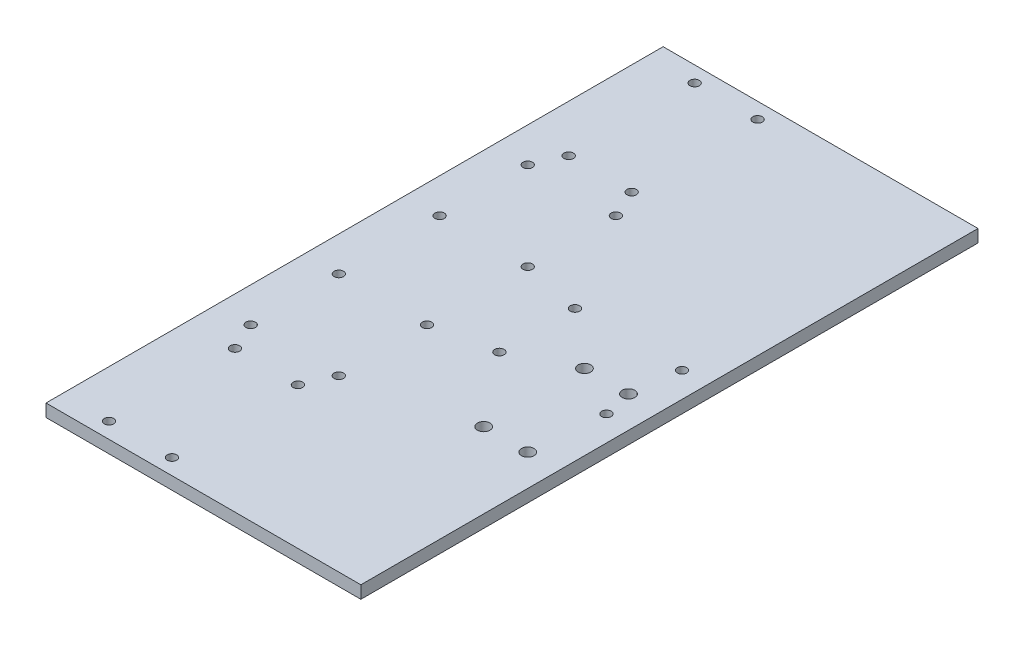
ISO-10303-21;
HEADER;
FILE_DESCRIPTION(('STEP AP214'),'2;1');
FILE_NAME('part.step','',(''),(''),'','','');
FILE_SCHEMA(('AUTOMOTIVE_DESIGN { 1 0 10303 214 1 1 1 1 }'));
ENDSEC;
DATA;
#1=APPLICATION_CONTEXT('core data for automotive mechanical design processes');
#2=APPLICATION_PROTOCOL_DEFINITION('international standard','automotive_design',2000,#1);
#3=PRODUCT_CONTEXT('',#1,'mechanical');
#4=PRODUCT('Part','Part','',(#3));
#5=PRODUCT_RELATED_PRODUCT_CATEGORY('part','',(#4));
#6=PRODUCT_DEFINITION_FORMATION('','',#4);
#7=PRODUCT_DEFINITION_CONTEXT('part definition',#1,'design');
#8=PRODUCT_DEFINITION('design','',#6,#7);
#9=PRODUCT_DEFINITION_SHAPE('','',#8);
#10=(LENGTH_UNIT() NAMED_UNIT(*) SI_UNIT(.MILLI.,.METRE.));
#11=(NAMED_UNIT(*) PLANE_ANGLE_UNIT() SI_UNIT($,.RADIAN.));
#12=(NAMED_UNIT(*) SI_UNIT($,.STERADIAN.) SOLID_ANGLE_UNIT());
#13=UNCERTAINTY_MEASURE_WITH_UNIT(LENGTH_MEASURE(1.E-05),#10,'distance_accuracy_value','');
#14=(GEOMETRIC_REPRESENTATION_CONTEXT(3) GLOBAL_UNCERTAINTY_ASSIGNED_CONTEXT((#13)) GLOBAL_UNIT_ASSIGNED_CONTEXT((#10,
#11,#12)) REPRESENTATION_CONTEXT('',''));
#15=CARTESIAN_POINT('',(0.,0.,0.));
#16=DIRECTION('',(0.,0.,1.));
#17=DIRECTION('',(1.,0.,0.));
#18=AXIS2_PLACEMENT_3D('',#15,#16,#17);
#19=CARTESIAN_POINT('',(-15.,-6.,-53.));
#20=DIRECTION('',(0.,1.,0.));
#21=DIRECTION('',(0.,0.,1.));
#22=AXIS2_PLACEMENT_3D('',#19,#20,#21);
#23=CYLINDRICAL_SURFACE('',#22,1.5);
#24=CARTESIAN_POINT('',(-15.,0.,-53.));
#25=DIRECTION('',(0.,-1.,0.));
#26=DIRECTION('',(0.,0.,-1.));
#27=AXIS2_PLACEMENT_3D('',#24,#25,#26);
#28=CIRCLE('',#27,1.5);
#29=CARTESIAN_POINT('',(-15.,0.,-54.5));
#30=VERTEX_POINT('',#29);
#31=EDGE_CURVE('E51',#30,#30,#28,.T.);
#32=ORIENTED_EDGE('',*,*,#31,.T.);
#33=EDGE_LOOP('',(#32));
#34=FACE_BOUND('',#33,.T.);
#35=CARTESIAN_POINT('',(-15.,4.,-53.));
#36=DIRECTION('',(0.,1.,0.));
#37=DIRECTION('',(0.,0.,1.));
#38=AXIS2_PLACEMENT_3D('',#35,#36,#37);
#39=CIRCLE('',#38,1.5);
#40=CARTESIAN_POINT('',(-15.,4.,-51.5));
#41=VERTEX_POINT('',#40);
#42=EDGE_CURVE('E11',#41,#41,#39,.T.);
#43=ORIENTED_EDGE('',*,*,#42,.T.);
#44=EDGE_LOOP('',(#43));
#45=FACE_BOUND('',#44,.T.);
#46=ADVANCED_FACE('F43',(#34,#45),#23,.F.);
#47=CARTESIAN_POINT('',(-15.,-6.,-93.));
#48=DIRECTION('',(0.,1.,0.));
#49=DIRECTION('',(0.,0.,1.));
#50=AXIS2_PLACEMENT_3D('',#47,#48,#49);
#51=CYLINDRICAL_SURFACE('',#50,1.5);
#52=CARTESIAN_POINT('',(-15.,0.,-93.));
#53=DIRECTION('',(0.,-1.,0.));
#54=DIRECTION('',(0.,0.,-1.));
#55=AXIS2_PLACEMENT_3D('',#52,#53,#54);
#56=CIRCLE('',#55,1.5);
#57=CARTESIAN_POINT('',(-15.,0.,-94.5));
#58=VERTEX_POINT('',#57);
#59=EDGE_CURVE('E222',#58,#58,#56,.T.);
#60=ORIENTED_EDGE('',*,*,#59,.T.);
#61=EDGE_LOOP('',(#60));
#62=FACE_BOUND('',#61,.T.);
#63=CARTESIAN_POINT('',(-15.,4.,-93.));
#64=DIRECTION('',(0.,1.,0.));
#65=DIRECTION('',(0.,0.,1.));
#66=AXIS2_PLACEMENT_3D('',#63,#64,#65);
#67=CIRCLE('',#66,1.5);
#68=CARTESIAN_POINT('',(-15.,4.,-91.5));
#69=VERTEX_POINT('',#68);
#70=EDGE_CURVE('E229',#69,#69,#67,.T.);
#71=ORIENTED_EDGE('',*,*,#70,.T.);
#72=EDGE_LOOP('',(#71));
#73=FACE_BOUND('',#72,.T.);
#74=ADVANCED_FACE('F287',(#62,#73),#51,.F.);
#75=CARTESIAN_POINT('',(50.,4.,80.));
#76=DIRECTION('',(-1.,0.,0.));
#77=DIRECTION('',(0.,0.,1.));
#78=AXIS2_PLACEMENT_3D('',#75,#76,#77);
#79=PLANE('',#78);
#80=DIRECTION('',(0.,0.,-1.));
#81=VECTOR('',#80,1.);
#82=CARTESIAN_POINT('',(50.,0.,80.));
#83=LINE('',#82,#81);
#84=CARTESIAN_POINT('',(50.,0.,98.));
#85=VERTEX_POINT('',#84);
#86=CARTESIAN_POINT('',(50.,0.,-98.));
#87=VERTEX_POINT('',#86);
#88=EDGE_CURVE('E218',#85,#87,#83,.T.);
#89=ORIENTED_EDGE('',*,*,#88,.T.);
#90=DIRECTION('',(0.,-1.,0.));
#91=VECTOR('',#90,1.);
#92=CARTESIAN_POINT('',(50.,4.,-98.));
#93=LINE('',#92,#91);
#94=CARTESIAN_POINT('',(50.,4.,-98.));
#95=VERTEX_POINT('',#94);
#96=EDGE_CURVE('E92',#95,#87,#93,.T.);
#97=ORIENTED_EDGE('',*,*,#96,.F.);
#98=DIRECTION('',(0.,0.,-1.));
#99=VECTOR('',#98,1.);
#100=CARTESIAN_POINT('',(50.,4.,80.));
#101=LINE('',#100,#99);
#102=CARTESIAN_POINT('',(50.,4.,98.));
#103=VERTEX_POINT('',#102);
#104=EDGE_CURVE('E59',#103,#95,#101,.T.);
#105=ORIENTED_EDGE('',*,*,#104,.F.);
#106=DIRECTION('',(0.,-1.,0.));
#107=VECTOR('',#106,1.);
#108=CARTESIAN_POINT('',(50.,4.,98.));
#109=LINE('',#108,#107);
#110=EDGE_CURVE('E89',#103,#85,#109,.T.);
#111=ORIENTED_EDGE('',*,*,#110,.T.);
#112=EDGE_LOOP('',(#89,#97,#105,#111));
#113=FACE_BOUND('',#112,.T.);
#114=ADVANCED_FACE('F88',(#113),#79,.F.);
#115=CARTESIAN_POINT('',(-50.,4.,80.));
#116=DIRECTION('',(1.,0.,0.));
#117=DIRECTION('',(0.,0.,-1.));
#118=AXIS2_PLACEMENT_3D('',#115,#116,#117);
#119=PLANE('',#118);
#120=DIRECTION('',(0.,0.,1.));
#121=VECTOR('',#120,1.);
#122=CARTESIAN_POINT('',(-50.,0.,80.));
#123=LINE('',#122,#121);
#124=CARTESIAN_POINT('',(-50.,0.,-98.));
#125=VERTEX_POINT('',#124);
#126=CARTESIAN_POINT('',(-50.,0.,98.));
#127=VERTEX_POINT('',#126);
#128=EDGE_CURVE('E93',#125,#127,#123,.T.);
#129=ORIENTED_EDGE('',*,*,#128,.T.);
#130=DIRECTION('',(0.,1.,0.));
#131=VECTOR('',#130,1.);
#132=CARTESIAN_POINT('',(-50.,0.,98.));
#133=LINE('',#132,#131);
#134=CARTESIAN_POINT('',(-50.,4.,98.));
#135=VERTEX_POINT('',#134);
#136=EDGE_CURVE('E106',#127,#135,#133,.T.);
#137=ORIENTED_EDGE('',*,*,#136,.T.);
#138=DIRECTION('',(0.,0.,1.));
#139=VECTOR('',#138,1.);
#140=CARTESIAN_POINT('',(-50.,4.,80.));
#141=LINE('',#140,#139);
#142=CARTESIAN_POINT('',(-50.,4.,-98.));
#143=VERTEX_POINT('',#142);
#144=EDGE_CURVE('E67',#143,#135,#141,.T.);
#145=ORIENTED_EDGE('',*,*,#144,.F.);
#146=DIRECTION('',(0.,1.,0.));
#147=VECTOR('',#146,1.);
#148=CARTESIAN_POINT('',(-50.,0.,-98.));
#149=LINE('',#148,#147);
#150=EDGE_CURVE('E120',#125,#143,#149,.T.);
#151=ORIENTED_EDGE('',*,*,#150,.F.);
#152=EDGE_LOOP('',(#129,#137,#145,#151));
#153=FACE_BOUND('',#152,.T.);
#154=ADVANCED_FACE('F300',(#153),#119,.F.);
#155=CARTESIAN_POINT('',(0.,4.,0.));
#156=DIRECTION('',(0.,-1.,0.));
#157=DIRECTION('',(0.,0.,-1.));
#158=AXIS2_PLACEMENT_3D('',#155,#156,#157);
#159=PLANE('',#158);
#160=CARTESIAN_POINT('',(-15.,4.,93.));
#161=DIRECTION('',(0.,-1.,0.));
#162=DIRECTION('',(0.,0.,-1.));
#163=AXIS2_PLACEMENT_3D('',#160,#161,#162);
#164=CIRCLE('',#163,1.5);
#165=CARTESIAN_POINT('',(-15.,4.,91.5));
#166=VERTEX_POINT('',#165);
#167=EDGE_CURVE('E256',#166,#166,#164,.T.);
#168=ORIENTED_EDGE('',*,*,#167,.T.);
#169=EDGE_LOOP('',(#168));
#170=FACE_BOUND('',#169,.T.);
#171=CARTESIAN_POINT('',(-35.,4.,53.));
#172=DIRECTION('',(0.,-1.,0.));
#173=DIRECTION('',(0.,0.,-1.));
#174=AXIS2_PLACEMENT_3D('',#171,#172,#173);
#175=CIRCLE('',#174,1.5);
#176=CARTESIAN_POINT('',(-35.,4.,51.5));
#177=VERTEX_POINT('',#176);
#178=EDGE_CURVE('E257',#177,#177,#175,.T.);
#179=ORIENTED_EDGE('',*,*,#178,.T.);
#180=EDGE_LOOP('',(#179));
#181=FACE_BOUND('',#180,.T.);
#182=CARTESIAN_POINT('',(-15.,4.,53.));
#183=DIRECTION('',(0.,-1.,0.));
#184=DIRECTION('',(0.,0.,-1.));
#185=AXIS2_PLACEMENT_3D('',#182,#183,#184);
#186=CIRCLE('',#185,1.5);
#187=CARTESIAN_POINT('',(-15.,4.,51.5));
#188=VERTEX_POINT('',#187);
#189=EDGE_CURVE('E260',#188,#188,#186,.T.);
#190=ORIENTED_EDGE('',*,*,#189,.T.);
#191=EDGE_LOOP('',(#190));
#192=FACE_BOUND('',#191,.T.);
#193=CARTESIAN_POINT('',(-35.,4.,93.));
#194=DIRECTION('',(0.,-1.,0.));
#195=DIRECTION('',(0.,0.,-1.));
#196=AXIS2_PLACEMENT_3D('',#193,#194,#195);
#197=CIRCLE('',#196,1.5);
#198=CARTESIAN_POINT('',(-35.,4.,91.5));
#199=VERTEX_POINT('',#198);
#200=EDGE_CURVE('E238',#199,#199,#197,.T.);
#201=ORIENTED_EDGE('',*,*,#200,.T.);
#202=EDGE_LOOP('',(#201));
#203=FACE_BOUND('',#202,.T.);
#204=CARTESIAN_POINT('',(-35.,4.,-53.));
#205=DIRECTION('',(0.,1.,0.));
#206=DIRECTION('',(0.,0.,1.));
#207=AXIS2_PLACEMENT_3D('',#204,#205,#206);
#208=CIRCLE('',#207,1.5);
#209=CARTESIAN_POINT('',(-35.,4.,-51.5));
#210=VERTEX_POINT('',#209);
#211=EDGE_CURVE('E102',#210,#210,#208,.T.);
#212=ORIENTED_EDGE('',*,*,#211,.F.);
#213=EDGE_LOOP('',(#212));
#214=FACE_BOUND('',#213,.T.);
#215=CARTESIAN_POINT('',(-35.,4.,-93.));
#216=DIRECTION('',(0.,1.,0.));
#217=DIRECTION('',(0.,0.,1.));
#218=AXIS2_PLACEMENT_3D('',#215,#216,#217);
#219=CIRCLE('',#218,1.5);
#220=CARTESIAN_POINT('',(-35.,4.,-91.5));
#221=VERTEX_POINT('',#220);
#222=EDGE_CURVE('E112',#221,#221,#219,.T.);
#223=ORIENTED_EDGE('',*,*,#222,.F.);
#224=EDGE_LOOP('',(#223));
#225=FACE_BOUND('',#224,.T.);
#226=CARTESIAN_POINT('',(8.,4.,-12.));
#227=DIRECTION('',(0.,1.,0.));
#228=DIRECTION('',(0.,0.,-1.));
#229=AXIS2_PLACEMENT_3D('',#226,#227,#228);
#230=CIRCLE('',#229,1.5);
#231=CARTESIAN_POINT('',(8.,4.,-13.5));
#232=VERTEX_POINT('',#231);
#233=EDGE_CURVE('E131',#232,#232,#230,.T.);
#234=ORIENTED_EDGE('',*,*,#233,.F.);
#235=EDGE_LOOP('',(#234));
#236=FACE_BOUND('',#235,.T.);
#237=CARTESIAN_POINT('',(42.,4.,12.));
#238=DIRECTION('',(0.,1.,0.));
#239=DIRECTION('',(0.,0.,-1.));
#240=AXIS2_PLACEMENT_3D('',#237,#238,#239);
#241=CIRCLE('',#240,1.5);
#242=CARTESIAN_POINT('',(42.,4.,10.5));
#243=VERTEX_POINT('',#242);
#244=EDGE_CURVE('E138',#243,#243,#241,.T.);
#245=ORIENTED_EDGE('',*,*,#244,.F.);
#246=EDGE_LOOP('',(#245));
#247=FACE_BOUND('',#246,.T.);
#248=CARTESIAN_POINT('',(8.,4.,12.));
#249=DIRECTION('',(0.,1.,0.));
#250=DIRECTION('',(0.,0.,1.));
#251=AXIS2_PLACEMENT_3D('',#248,#249,#250);
#252=CIRCLE('',#251,1.5);
#253=CARTESIAN_POINT('',(8.,4.,13.5));
#254=VERTEX_POINT('',#253);
#255=EDGE_CURVE('E125',#254,#254,#252,.T.);
#256=ORIENTED_EDGE('',*,*,#255,.F.);
#257=EDGE_LOOP('',(#256));
#258=FACE_BOUND('',#257,.T.);
#259=CARTESIAN_POINT('',(42.,4.,-12.));
#260=DIRECTION('',(0.,1.,0.));
#261=DIRECTION('',(0.,0.,1.));
#262=AXIS2_PLACEMENT_3D('',#259,#260,#261);
#263=CIRCLE('',#262,1.5);
#264=CARTESIAN_POINT('',(42.,4.,-10.5));
#265=VERTEX_POINT('',#264);
#266=EDGE_CURVE('E134',#265,#265,#263,.T.);
#267=ORIENTED_EDGE('',*,*,#266,.F.);
#268=EDGE_LOOP('',(#267));
#269=FACE_BOUND('',#268,.T.);
#270=CARTESIAN_POINT('',(-39.,4.,16.));
#271=DIRECTION('',(0.,-1.,0.));
#272=DIRECTION('',(0.,0.,-1.));
#273=AXIS2_PLACEMENT_3D('',#270,#271,#272);
#274=CIRCLE('',#273,1.5);
#275=CARTESIAN_POINT('',(-39.,4.,14.5));
#276=VERTEX_POINT('',#275);
#277=EDGE_CURVE('E146',#276,#276,#274,.T.);
#278=ORIENTED_EDGE('',*,*,#277,.T.);
#279=EDGE_LOOP('',(#278));
#280=FACE_BOUND('',#279,.T.);
#281=CARTESIAN_POINT('',(-11.,4.,16.));
#282=DIRECTION('',(0.,-1.,0.));
#283=DIRECTION('',(0.,0.,-1.));
#284=AXIS2_PLACEMENT_3D('',#281,#282,#283);
#285=CIRCLE('',#284,1.5);
#286=CARTESIAN_POINT('',(-11.,4.,14.5));
#287=VERTEX_POINT('',#286);
#288=EDGE_CURVE('E159',#287,#287,#285,.T.);
#289=ORIENTED_EDGE('',*,*,#288,.T.);
#290=EDGE_LOOP('',(#289));
#291=FACE_BOUND('',#290,.T.);
#292=CARTESIAN_POINT('',(-11.,4.,44.));
#293=DIRECTION('',(0.,-1.,0.));
#294=DIRECTION('',(0.,0.,-1.));
#295=AXIS2_PLACEMENT_3D('',#292,#293,#294);
#296=CIRCLE('',#295,1.5);
#297=CARTESIAN_POINT('',(-11.,4.,42.5));
#298=VERTEX_POINT('',#297);
#299=EDGE_CURVE('E153',#298,#298,#296,.T.);
#300=ORIENTED_EDGE('',*,*,#299,.T.);
#301=EDGE_LOOP('',(#300));
#302=FACE_BOUND('',#301,.T.);
#303=CARTESIAN_POINT('',(-39.,4.,44.));
#304=DIRECTION('',(0.,-1.,0.));
#305=DIRECTION('',(0.,0.,-1.));
#306=AXIS2_PLACEMENT_3D('',#303,#304,#305);
#307=CIRCLE('',#306,1.5);
#308=CARTESIAN_POINT('',(-39.,4.,42.5));
#309=VERTEX_POINT('',#308);
#310=EDGE_CURVE('E152',#309,#309,#307,.T.);
#311=ORIENTED_EDGE('',*,*,#310,.T.);
#312=EDGE_LOOP('',(#311));
#313=FACE_BOUND('',#312,.T.);
#314=CARTESIAN_POINT('',(-39.,4.,-16.));
#315=DIRECTION('',(0.,1.,0.));
#316=DIRECTION('',(0.,0.,1.));
#317=AXIS2_PLACEMENT_3D('',#314,#315,#316);
#318=CIRCLE('',#317,1.5);
#319=CARTESIAN_POINT('',(-39.,4.,-14.5));
#320=VERTEX_POINT('',#319);
#321=EDGE_CURVE('E186',#320,#320,#318,.T.);
#322=ORIENTED_EDGE('',*,*,#321,.F.);
#323=EDGE_LOOP('',(#322));
#324=FACE_BOUND('',#323,.T.);
#325=CARTESIAN_POINT('',(-11.,4.,-16.));
#326=DIRECTION('',(0.,1.,0.));
#327=DIRECTION('',(0.,0.,1.));
#328=AXIS2_PLACEMENT_3D('',#325,#326,#327);
#329=CIRCLE('',#328,1.5);
#330=CARTESIAN_POINT('',(-11.,4.,-14.5));
#331=VERTEX_POINT('',#330);
#332=EDGE_CURVE('E180',#331,#331,#329,.T.);
#333=ORIENTED_EDGE('',*,*,#332,.F.);
#334=EDGE_LOOP('',(#333));
#335=FACE_BOUND('',#334,.T.);
#336=CARTESIAN_POINT('',(-11.,4.,-44.));
#337=DIRECTION('',(0.,1.,0.));
#338=DIRECTION('',(0.,0.,1.));
#339=AXIS2_PLACEMENT_3D('',#336,#337,#338);
#340=CIRCLE('',#339,1.5);
#341=CARTESIAN_POINT('',(-11.,4.,-42.5));
#342=VERTEX_POINT('',#341);
#343=EDGE_CURVE('E173',#342,#342,#340,.T.);
#344=ORIENTED_EDGE('',*,*,#343,.F.);
#345=EDGE_LOOP('',(#344));
#346=FACE_BOUND('',#345,.T.);
#347=CARTESIAN_POINT('',(-39.,4.,-44.));
#348=DIRECTION('',(0.,1.,0.));
#349=DIRECTION('',(0.,0.,1.));
#350=AXIS2_PLACEMENT_3D('',#347,#348,#349);
#351=CIRCLE('',#350,1.5);
#352=CARTESIAN_POINT('',(-39.,4.,-42.5));
#353=VERTEX_POINT('',#352);
#354=EDGE_CURVE('E176',#353,#353,#351,.T.);
#355=ORIENTED_EDGE('',*,*,#354,.F.);
#356=EDGE_LOOP('',(#355));
#357=FACE_BOUND('',#356,.T.);
#358=CARTESIAN_POINT('',(26.,4.,3.));
#359=DIRECTION('',(0.,1.,0.));
#360=DIRECTION('',(0.,0.,1.));
#361=AXIS2_PLACEMENT_3D('',#358,#359,#360);
#362=CIRCLE('',#361,2.);
#363=CARTESIAN_POINT('',(26.,4.,5.));
#364=VERTEX_POINT('',#363);
#365=EDGE_CURVE('E203',#364,#364,#362,.T.);
#366=ORIENTED_EDGE('',*,*,#365,.F.);
#367=EDGE_LOOP('',(#366));
#368=FACE_BOUND('',#367,.T.);
#369=CARTESIAN_POINT('',(40.,4.,35.));
#370=DIRECTION('',(0.,1.,0.));
#371=DIRECTION('',(0.,0.,-1.));
#372=AXIS2_PLACEMENT_3D('',#369,#370,#371);
#373=CIRCLE('',#372,2.);
#374=CARTESIAN_POINT('',(40.,4.,33.));
#375=VERTEX_POINT('',#374);
#376=EDGE_CURVE('E210',#375,#375,#373,.T.);
#377=ORIENTED_EDGE('',*,*,#376,.F.);
#378=EDGE_LOOP('',(#377));
#379=FACE_BOUND('',#378,.T.);
#380=CARTESIAN_POINT('',(26.,4.,35.));
#381=DIRECTION('',(0.,1.,0.));
#382=DIRECTION('',(0.,0.,-1.));
#383=AXIS2_PLACEMENT_3D('',#380,#381,#382);
#384=CIRCLE('',#383,2.);
#385=CARTESIAN_POINT('',(26.,4.,33.));
#386=VERTEX_POINT('',#385);
#387=EDGE_CURVE('E197',#386,#386,#384,.T.);
#388=ORIENTED_EDGE('',*,*,#387,.F.);
#389=EDGE_LOOP('',(#388));
#390=FACE_BOUND('',#389,.T.);
#391=CARTESIAN_POINT('',(40.,4.,3.));
#392=DIRECTION('',(0.,1.,0.));
#393=DIRECTION('',(0.,0.,1.));
#394=AXIS2_PLACEMENT_3D('',#391,#392,#393);
#395=CIRCLE('',#394,2.);
#396=CARTESIAN_POINT('',(40.,4.,5.));
#397=VERTEX_POINT('',#396);
#398=EDGE_CURVE('E206',#397,#397,#395,.T.);
#399=ORIENTED_EDGE('',*,*,#398,.F.);
#400=EDGE_LOOP('',(#399));
#401=FACE_BOUND('',#400,.T.);
#402=ORIENTED_EDGE('',*,*,#104,.T.);
#403=DIRECTION('',(1.,0.,0.));
#404=VECTOR('',#403,1.);
#405=CARTESIAN_POINT('',(-50.,4.,-98.));
#406=LINE('',#405,#404);
#407=EDGE_CURVE('E122',#143,#95,#406,.T.);
#408=ORIENTED_EDGE('',*,*,#407,.F.);
#409=ORIENTED_EDGE('',*,*,#144,.T.);
#410=DIRECTION('',(1.,0.,0.));
#411=VECTOR('',#410,1.);
#412=CARTESIAN_POINT('',(-50.,4.,98.));
#413=LINE('',#412,#411);
#414=EDGE_CURVE('E99',#135,#103,#413,.T.);
#415=ORIENTED_EDGE('',*,*,#414,.T.);
#416=EDGE_LOOP('',(#402,#408,#409,#415));
#417=FACE_BOUND('',#416,.T.);
#418=ORIENTED_EDGE('',*,*,#70,.F.);
#419=EDGE_LOOP('',(#418));
#420=FACE_BOUND('',#419,.T.);
#421=ORIENTED_EDGE('',*,*,#42,.F.);
#422=EDGE_LOOP('',(#421));
#423=FACE_BOUND('',#422,.T.);
#424=ADVANCED_FACE('F104',(#170,#181,#192,#203,#214,#225,#236,#247,#258,#269,#280,#291,#302,
#313,#324,#335,#346,#357,#368,#379,#390,#401,#417,#420,#423),#159,.F.);
#425=CARTESIAN_POINT('',(0.,0.,0.));
#426=DIRECTION('',(0.,-1.,0.));
#427=DIRECTION('',(0.,0.,-1.));
#428=AXIS2_PLACEMENT_3D('',#425,#426,#427);
#429=PLANE('',#428);
#430=CARTESIAN_POINT('',(-15.,0.,93.));
#431=DIRECTION('',(0.,-1.,0.));
#432=DIRECTION('',(0.,0.,-1.));
#433=AXIS2_PLACEMENT_3D('',#430,#431,#432);
#434=CIRCLE('',#433,1.5);
#435=CARTESIAN_POINT('',(-15.,0.,91.5));
#436=VERTEX_POINT('',#435);
#437=EDGE_CURVE('E46',#436,#436,#434,.F.);
#438=ORIENTED_EDGE('',*,*,#437,.T.);
#439=EDGE_LOOP('',(#438));
#440=FACE_BOUND('',#439,.T.);
#441=CARTESIAN_POINT('',(-35.,0.,53.));
#442=DIRECTION('',(0.,-1.,0.));
#443=DIRECTION('',(0.,0.,-1.));
#444=AXIS2_PLACEMENT_3D('',#441,#442,#443);
#445=CIRCLE('',#444,1.5);
#446=CARTESIAN_POINT('',(-35.,0.,51.5));
#447=VERTEX_POINT('',#446);
#448=EDGE_CURVE('E240',#447,#447,#445,.F.);
#449=ORIENTED_EDGE('',*,*,#448,.T.);
#450=EDGE_LOOP('',(#449));
#451=FACE_BOUND('',#450,.T.);
#452=CARTESIAN_POINT('',(-15.,0.,53.));
#453=DIRECTION('',(0.,-1.,0.));
#454=DIRECTION('',(0.,0.,-1.));
#455=AXIS2_PLACEMENT_3D('',#452,#453,#454);
#456=CIRCLE('',#455,1.5);
#457=CARTESIAN_POINT('',(-15.,0.,51.5));
#458=VERTEX_POINT('',#457);
#459=EDGE_CURVE('E237',#458,#458,#456,.F.);
#460=ORIENTED_EDGE('',*,*,#459,.T.);
#461=EDGE_LOOP('',(#460));
#462=FACE_BOUND('',#461,.T.);
#463=CARTESIAN_POINT('',(-35.,0.,93.));
#464=DIRECTION('',(0.,-1.,0.));
#465=DIRECTION('',(0.,0.,-1.));
#466=AXIS2_PLACEMENT_3D('',#463,#464,#465);
#467=CIRCLE('',#466,1.5);
#468=CARTESIAN_POINT('',(-35.,0.,91.5));
#469=VERTEX_POINT('',#468);
#470=EDGE_CURVE('E234',#469,#469,#467,.F.);
#471=ORIENTED_EDGE('',*,*,#470,.T.);
#472=EDGE_LOOP('',(#471));
#473=FACE_BOUND('',#472,.T.);
#474=CARTESIAN_POINT('',(-35.,0.,-53.));
#475=DIRECTION('',(0.,-1.,0.));
#476=DIRECTION('',(0.,0.,-1.));
#477=AXIS2_PLACEMENT_3D('',#474,#475,#476);
#478=CIRCLE('',#477,1.5);
#479=CARTESIAN_POINT('',(-35.,0.,-54.5));
#480=VERTEX_POINT('',#479);
#481=EDGE_CURVE('E245',#480,#480,#478,.T.);
#482=ORIENTED_EDGE('',*,*,#481,.F.);
#483=EDGE_LOOP('',(#482));
#484=FACE_BOUND('',#483,.T.);
#485=CARTESIAN_POINT('',(-35.,0.,-93.));
#486=DIRECTION('',(0.,-1.,0.));
#487=DIRECTION('',(0.,0.,-1.));
#488=AXIS2_PLACEMENT_3D('',#485,#486,#487);
#489=CIRCLE('',#488,1.5);
#490=CARTESIAN_POINT('',(-35.,0.,-94.5));
#491=VERTEX_POINT('',#490);
#492=EDGE_CURVE('E115',#491,#491,#489,.T.);
#493=ORIENTED_EDGE('',*,*,#492,.F.);
#494=EDGE_LOOP('',(#493));
#495=FACE_BOUND('',#494,.T.);
#496=CARTESIAN_POINT('',(8.,0.,-12.));
#497=DIRECTION('',(0.,1.,0.));
#498=DIRECTION('',(0.,0.,-1.));
#499=AXIS2_PLACEMENT_3D('',#496,#497,#498);
#500=CIRCLE('',#499,1.5);
#501=CARTESIAN_POINT('',(8.,0.,-13.5));
#502=VERTEX_POINT('',#501);
#503=EDGE_CURVE('E135',#502,#502,#500,.T.);
#504=ORIENTED_EDGE('',*,*,#503,.T.);
#505=EDGE_LOOP('',(#504));
#506=FACE_BOUND('',#505,.T.);
#507=CARTESIAN_POINT('',(42.,0.,12.));
#508=DIRECTION('',(0.,1.,0.));
#509=DIRECTION('',(0.,0.,-1.));
#510=AXIS2_PLACEMENT_3D('',#507,#508,#509);
#511=CIRCLE('',#510,1.5);
#512=CARTESIAN_POINT('',(42.,0.,10.5));
#513=VERTEX_POINT('',#512);
#514=EDGE_CURVE('E128',#513,#513,#511,.T.);
#515=ORIENTED_EDGE('',*,*,#514,.T.);
#516=EDGE_LOOP('',(#515));
#517=FACE_BOUND('',#516,.T.);
#518=CARTESIAN_POINT('',(8.,0.,12.));
#519=DIRECTION('',(0.,1.,0.));
#520=DIRECTION('',(0.,0.,1.));
#521=AXIS2_PLACEMENT_3D('',#518,#519,#520);
#522=CIRCLE('',#521,1.5);
#523=CARTESIAN_POINT('',(8.,0.,13.5));
#524=VERTEX_POINT('',#523);
#525=EDGE_CURVE('E124',#524,#524,#522,.T.);
#526=ORIENTED_EDGE('',*,*,#525,.T.);
#527=EDGE_LOOP('',(#526));
#528=FACE_BOUND('',#527,.T.);
#529=CARTESIAN_POINT('',(42.,0.,-12.));
#530=DIRECTION('',(0.,1.,0.));
#531=DIRECTION('',(0.,0.,1.));
#532=AXIS2_PLACEMENT_3D('',#529,#530,#531);
#533=CIRCLE('',#532,1.5);
#534=CARTESIAN_POINT('',(42.,0.,-10.5));
#535=VERTEX_POINT('',#534);
#536=EDGE_CURVE('E143',#535,#535,#533,.T.);
#537=ORIENTED_EDGE('',*,*,#536,.T.);
#538=EDGE_LOOP('',(#537));
#539=FACE_BOUND('',#538,.T.);
#540=CARTESIAN_POINT('',(-39.,0.,16.));
#541=DIRECTION('',(0.,-1.,0.));
#542=DIRECTION('',(0.,0.,-1.));
#543=AXIS2_PLACEMENT_3D('',#540,#541,#542);
#544=CIRCLE('',#543,1.5);
#545=CARTESIAN_POINT('',(-39.,0.,14.5));
#546=VERTEX_POINT('',#545);
#547=EDGE_CURVE('E162',#546,#546,#544,.T.);
#548=ORIENTED_EDGE('',*,*,#547,.F.);
#549=EDGE_LOOP('',(#548));
#550=FACE_BOUND('',#549,.T.);
#551=CARTESIAN_POINT('',(-11.,0.,16.));
#552=DIRECTION('',(0.,-1.,0.));
#553=DIRECTION('',(0.,0.,-1.));
#554=AXIS2_PLACEMENT_3D('',#551,#552,#553);
#555=CIRCLE('',#554,1.5);
#556=CARTESIAN_POINT('',(-11.,0.,14.5));
#557=VERTEX_POINT('',#556);
#558=EDGE_CURVE('E156',#557,#557,#555,.T.);
#559=ORIENTED_EDGE('',*,*,#558,.F.);
#560=EDGE_LOOP('',(#559));
#561=FACE_BOUND('',#560,.T.);
#562=CARTESIAN_POINT('',(-11.,0.,44.));
#563=DIRECTION('',(0.,-1.,0.));
#564=DIRECTION('',(0.,0.,-1.));
#565=AXIS2_PLACEMENT_3D('',#562,#563,#564);
#566=CIRCLE('',#565,1.5);
#567=CARTESIAN_POINT('',(-11.,0.,42.5));
#568=VERTEX_POINT('',#567);
#569=EDGE_CURVE('E149',#568,#568,#566,.T.);
#570=ORIENTED_EDGE('',*,*,#569,.F.);
#571=EDGE_LOOP('',(#570));
#572=FACE_BOUND('',#571,.T.);
#573=CARTESIAN_POINT('',(-39.,0.,44.));
#574=DIRECTION('',(0.,-1.,0.));
#575=DIRECTION('',(0.,0.,-1.));
#576=AXIS2_PLACEMENT_3D('',#573,#574,#575);
#577=CIRCLE('',#576,1.5);
#578=CARTESIAN_POINT('',(-39.,0.,42.5));
#579=VERTEX_POINT('',#578);
#580=EDGE_CURVE('E167',#579,#579,#577,.T.);
#581=ORIENTED_EDGE('',*,*,#580,.F.);
#582=EDGE_LOOP('',(#581));
#583=FACE_BOUND('',#582,.T.);
#584=CARTESIAN_POINT('',(-39.,0.,-16.));
#585=DIRECTION('',(0.,1.,0.));
#586=DIRECTION('',(0.,0.,1.));
#587=AXIS2_PLACEMENT_3D('',#584,#585,#586);
#588=CIRCLE('',#587,1.5);
#589=CARTESIAN_POINT('',(-39.,0.,-14.5));
#590=VERTEX_POINT('',#589);
#591=EDGE_CURVE('E170',#590,#590,#588,.T.);
#592=ORIENTED_EDGE('',*,*,#591,.T.);
#593=EDGE_LOOP('',(#592));
#594=FACE_BOUND('',#593,.T.);
#595=CARTESIAN_POINT('',(-11.,0.,-16.));
#596=DIRECTION('',(0.,1.,0.));
#597=DIRECTION('',(0.,0.,1.));
#598=AXIS2_PLACEMENT_3D('',#595,#596,#597);
#599=CIRCLE('',#598,1.5);
#600=CARTESIAN_POINT('',(-11.,0.,-14.5));
#601=VERTEX_POINT('',#600);
#602=EDGE_CURVE('E183',#601,#601,#599,.T.);
#603=ORIENTED_EDGE('',*,*,#602,.T.);
#604=EDGE_LOOP('',(#603));
#605=FACE_BOUND('',#604,.T.);
#606=CARTESIAN_POINT('',(-11.,0.,-44.));
#607=DIRECTION('',(0.,1.,0.));
#608=DIRECTION('',(0.,0.,1.));
#609=AXIS2_PLACEMENT_3D('',#606,#607,#608);
#610=CIRCLE('',#609,1.5);
#611=CARTESIAN_POINT('',(-11.,0.,-42.5));
#612=VERTEX_POINT('',#611);
#613=EDGE_CURVE('E177',#612,#612,#610,.T.);
#614=ORIENTED_EDGE('',*,*,#613,.T.);
#615=EDGE_LOOP('',(#614));
#616=FACE_BOUND('',#615,.T.);
#617=CARTESIAN_POINT('',(-39.,0.,-44.));
#618=DIRECTION('',(0.,1.,0.));
#619=DIRECTION('',(0.,0.,1.));
#620=AXIS2_PLACEMENT_3D('',#617,#618,#619);
#621=CIRCLE('',#620,1.5);
#622=CARTESIAN_POINT('',(-39.,0.,-42.5));
#623=VERTEX_POINT('',#622);
#624=EDGE_CURVE('E191',#623,#623,#621,.T.);
#625=ORIENTED_EDGE('',*,*,#624,.T.);
#626=EDGE_LOOP('',(#625));
#627=FACE_BOUND('',#626,.T.);
#628=CARTESIAN_POINT('',(26.,0.,3.));
#629=DIRECTION('',(0.,1.,0.));
#630=DIRECTION('',(0.,0.,1.));
#631=AXIS2_PLACEMENT_3D('',#628,#629,#630);
#632=CIRCLE('',#631,2.);
#633=CARTESIAN_POINT('',(26.,0.,5.));
#634=VERTEX_POINT('',#633);
#635=EDGE_CURVE('E207',#634,#634,#632,.T.);
#636=ORIENTED_EDGE('',*,*,#635,.T.);
#637=EDGE_LOOP('',(#636));
#638=FACE_BOUND('',#637,.T.);
#639=CARTESIAN_POINT('',(40.,0.,35.));
#640=DIRECTION('',(0.,1.,0.));
#641=DIRECTION('',(0.,0.,-1.));
#642=AXIS2_PLACEMENT_3D('',#639,#640,#641);
#643=CIRCLE('',#642,2.);
#644=CARTESIAN_POINT('',(40.,0.,33.));
#645=VERTEX_POINT('',#644);
#646=EDGE_CURVE('E200',#645,#645,#643,.T.);
#647=ORIENTED_EDGE('',*,*,#646,.T.);
#648=EDGE_LOOP('',(#647));
#649=FACE_BOUND('',#648,.T.);
#650=CARTESIAN_POINT('',(26.,0.,35.));
#651=DIRECTION('',(0.,1.,0.));
#652=DIRECTION('',(0.,0.,-1.));
#653=AXIS2_PLACEMENT_3D('',#650,#651,#652);
#654=CIRCLE('',#653,2.);
#655=CARTESIAN_POINT('',(26.,0.,33.));
#656=VERTEX_POINT('',#655);
#657=EDGE_CURVE('E194',#656,#656,#654,.T.);
#658=ORIENTED_EDGE('',*,*,#657,.T.);
#659=EDGE_LOOP('',(#658));
#660=FACE_BOUND('',#659,.T.);
#661=CARTESIAN_POINT('',(40.,0.,3.));
#662=DIRECTION('',(0.,1.,0.));
#663=DIRECTION('',(0.,0.,1.));
#664=AXIS2_PLACEMENT_3D('',#661,#662,#663);
#665=CIRCLE('',#664,2.);
#666=CARTESIAN_POINT('',(40.,0.,5.));
#667=VERTEX_POINT('',#666);
#668=EDGE_CURVE('E215',#667,#667,#665,.T.);
#669=ORIENTED_EDGE('',*,*,#668,.T.);
#670=EDGE_LOOP('',(#669));
#671=FACE_BOUND('',#670,.T.);
#672=ORIENTED_EDGE('',*,*,#88,.F.);
#673=DIRECTION('',(-1.,0.,0.));
#674=VECTOR('',#673,1.);
#675=CARTESIAN_POINT('',(50.,0.,98.));
#676=LINE('',#675,#674);
#677=EDGE_CURVE('E101',#85,#127,#676,.T.);
#678=ORIENTED_EDGE('',*,*,#677,.T.);
#679=ORIENTED_EDGE('',*,*,#128,.F.);
#680=DIRECTION('',(-1.,0.,0.));
#681=VECTOR('',#680,1.);
#682=CARTESIAN_POINT('',(50.,0.,-98.));
#683=LINE('',#682,#681);
#684=EDGE_CURVE('E117',#87,#125,#683,.T.);
#685=ORIENTED_EDGE('',*,*,#684,.F.);
#686=EDGE_LOOP('',(#672,#678,#679,#685));
#687=FACE_BOUND('',#686,.T.);
#688=ORIENTED_EDGE('',*,*,#59,.F.);
#689=EDGE_LOOP('',(#688));
#690=FACE_BOUND('',#689,.T.);
#691=ORIENTED_EDGE('',*,*,#31,.F.);
#692=EDGE_LOOP('',(#691));
#693=FACE_BOUND('',#692,.T.);
#694=ADVANCED_FACE('F299',(#440,#451,#462,#473,#484,#495,#506,#517,#528,#539,#550,#561,#572,
#583,#594,#605,#616,#627,#638,#649,#660,#671,#687,#690,#693),#429,.T.);
#695=CARTESIAN_POINT('',(40.,0.,3.));
#696=DIRECTION('',(0.,1.,0.));
#697=DIRECTION('',(0.,0.,1.));
#698=AXIS2_PLACEMENT_3D('',#695,#696,#697);
#699=CYLINDRICAL_SURFACE('',#698,2.);
#700=ORIENTED_EDGE('',*,*,#668,.F.);
#701=EDGE_LOOP('',(#700));
#702=FACE_BOUND('',#701,.T.);
#703=ORIENTED_EDGE('',*,*,#398,.T.);
#704=EDGE_LOOP('',(#703));
#705=FACE_BOUND('',#704,.T.);
#706=ADVANCED_FACE('F307',(#702,#705),#699,.F.);
#707=CARTESIAN_POINT('',(26.,0.,35.));
#708=DIRECTION('',(0.,1.,0.));
#709=DIRECTION('',(0.,0.,1.));
#710=AXIS2_PLACEMENT_3D('',#707,#708,#709);
#711=CYLINDRICAL_SURFACE('',#710,2.);
#712=ORIENTED_EDGE('',*,*,#657,.F.);
#713=EDGE_LOOP('',(#712));
#714=FACE_BOUND('',#713,.T.);
#715=ORIENTED_EDGE('',*,*,#387,.T.);
#716=EDGE_LOOP('',(#715));
#717=FACE_BOUND('',#716,.T.);
#718=ADVANCED_FACE('F440',(#714,#717),#711,.F.);
#719=CARTESIAN_POINT('',(40.,0.,35.));
#720=DIRECTION('',(0.,1.,0.));
#721=DIRECTION('',(0.,0.,1.));
#722=AXIS2_PLACEMENT_3D('',#719,#720,#721);
#723=CYLINDRICAL_SURFACE('',#722,2.);
#724=ORIENTED_EDGE('',*,*,#646,.F.);
#725=EDGE_LOOP('',(#724));
#726=FACE_BOUND('',#725,.T.);
#727=ORIENTED_EDGE('',*,*,#376,.T.);
#728=EDGE_LOOP('',(#727));
#729=FACE_BOUND('',#728,.T.);
#730=ADVANCED_FACE('F443',(#726,#729),#723,.F.);
#731=CARTESIAN_POINT('',(26.,0.,3.));
#732=DIRECTION('',(0.,1.,0.));
#733=DIRECTION('',(0.,0.,1.));
#734=AXIS2_PLACEMENT_3D('',#731,#732,#733);
#735=CYLINDRICAL_SURFACE('',#734,2.);
#736=ORIENTED_EDGE('',*,*,#635,.F.);
#737=EDGE_LOOP('',(#736));
#738=FACE_BOUND('',#737,.T.);
#739=ORIENTED_EDGE('',*,*,#365,.T.);
#740=EDGE_LOOP('',(#739));
#741=FACE_BOUND('',#740,.T.);
#742=ADVANCED_FACE('F438',(#738,#741),#735,.F.);
#743=CARTESIAN_POINT('',(-39.,0.,-44.));
#744=DIRECTION('',(0.,1.,0.));
#745=DIRECTION('',(0.,0.,1.));
#746=AXIS2_PLACEMENT_3D('',#743,#744,#745);
#747=CYLINDRICAL_SURFACE('',#746,1.5);
#748=ORIENTED_EDGE('',*,*,#624,.F.);
#749=EDGE_LOOP('',(#748));
#750=FACE_BOUND('',#749,.T.);
#751=ORIENTED_EDGE('',*,*,#354,.T.);
#752=EDGE_LOOP('',(#751));
#753=FACE_BOUND('',#752,.T.);
#754=ADVANCED_FACE('F428',(#750,#753),#747,.F.);
#755=CARTESIAN_POINT('',(-11.,0.,-44.));
#756=DIRECTION('',(0.,1.,0.));
#757=DIRECTION('',(0.,0.,1.));
#758=AXIS2_PLACEMENT_3D('',#755,#756,#757);
#759=CYLINDRICAL_SURFACE('',#758,1.5);
#760=ORIENTED_EDGE('',*,*,#613,.F.);
#761=EDGE_LOOP('',(#760));
#762=FACE_BOUND('',#761,.T.);
#763=ORIENTED_EDGE('',*,*,#343,.T.);
#764=EDGE_LOOP('',(#763));
#765=FACE_BOUND('',#764,.T.);
#766=ADVANCED_FACE('F424',(#762,#765),#759,.F.);
#767=CARTESIAN_POINT('',(-11.,0.,-16.));
#768=DIRECTION('',(0.,1.,0.));
#769=DIRECTION('',(0.,0.,1.));
#770=AXIS2_PLACEMENT_3D('',#767,#768,#769);
#771=CYLINDRICAL_SURFACE('',#770,1.5);
#772=ORIENTED_EDGE('',*,*,#602,.F.);
#773=EDGE_LOOP('',(#772));
#774=FACE_BOUND('',#773,.T.);
#775=ORIENTED_EDGE('',*,*,#332,.T.);
#776=EDGE_LOOP('',(#775));
#777=FACE_BOUND('',#776,.T.);
#778=ADVANCED_FACE('F427',(#774,#777),#771,.F.);
#779=CARTESIAN_POINT('',(-39.,0.,-16.));
#780=DIRECTION('',(0.,1.,0.));
#781=DIRECTION('',(0.,0.,1.));
#782=AXIS2_PLACEMENT_3D('',#779,#780,#781);
#783=CYLINDRICAL_SURFACE('',#782,1.5);
#784=ORIENTED_EDGE('',*,*,#591,.F.);
#785=EDGE_LOOP('',(#784));
#786=FACE_BOUND('',#785,.T.);
#787=ORIENTED_EDGE('',*,*,#321,.T.);
#788=EDGE_LOOP('',(#787));
#789=FACE_BOUND('',#788,.T.);
#790=ADVANCED_FACE('F422',(#786,#789),#783,.F.);
#791=CARTESIAN_POINT('',(-39.,0.,44.));
#792=DIRECTION('',(0.,1.,0.));
#793=DIRECTION('',(0.,0.,1.));
#794=AXIS2_PLACEMENT_3D('',#791,#792,#793);
#795=CYLINDRICAL_SURFACE('',#794,1.5);
#796=ORIENTED_EDGE('',*,*,#580,.T.);
#797=EDGE_LOOP('',(#796));
#798=FACE_BOUND('',#797,.T.);
#799=ORIENTED_EDGE('',*,*,#310,.F.);
#800=EDGE_LOOP('',(#799));
#801=FACE_BOUND('',#800,.T.);
#802=ADVANCED_FACE('F412',(#798,#801),#795,.F.);
#803=CARTESIAN_POINT('',(-11.,0.,44.));
#804=DIRECTION('',(0.,1.,0.));
#805=DIRECTION('',(0.,0.,1.));
#806=AXIS2_PLACEMENT_3D('',#803,#804,#805);
#807=CYLINDRICAL_SURFACE('',#806,1.5);
#808=ORIENTED_EDGE('',*,*,#569,.T.);
#809=EDGE_LOOP('',(#808));
#810=FACE_BOUND('',#809,.T.);
#811=ORIENTED_EDGE('',*,*,#299,.F.);
#812=EDGE_LOOP('',(#811));
#813=FACE_BOUND('',#812,.T.);
#814=ADVANCED_FACE('F408',(#810,#813),#807,.F.);
#815=CARTESIAN_POINT('',(-11.,0.,16.));
#816=DIRECTION('',(0.,1.,0.));
#817=DIRECTION('',(0.,0.,1.));
#818=AXIS2_PLACEMENT_3D('',#815,#816,#817);
#819=CYLINDRICAL_SURFACE('',#818,1.5);
#820=ORIENTED_EDGE('',*,*,#558,.T.);
#821=EDGE_LOOP('',(#820));
#822=FACE_BOUND('',#821,.T.);
#823=ORIENTED_EDGE('',*,*,#288,.F.);
#824=EDGE_LOOP('',(#823));
#825=FACE_BOUND('',#824,.T.);
#826=ADVANCED_FACE('F411',(#822,#825),#819,.F.);
#827=CARTESIAN_POINT('',(-39.,0.,16.));
#828=DIRECTION('',(0.,1.,0.));
#829=DIRECTION('',(0.,0.,1.));
#830=AXIS2_PLACEMENT_3D('',#827,#828,#829);
#831=CYLINDRICAL_SURFACE('',#830,1.5);
#832=ORIENTED_EDGE('',*,*,#547,.T.);
#833=EDGE_LOOP('',(#832));
#834=FACE_BOUND('',#833,.T.);
#835=ORIENTED_EDGE('',*,*,#277,.F.);
#836=EDGE_LOOP('',(#835));
#837=FACE_BOUND('',#836,.T.);
#838=ADVANCED_FACE('F406',(#834,#837),#831,.F.);
#839=CARTESIAN_POINT('',(42.,0.,-12.));
#840=DIRECTION('',(0.,1.,0.));
#841=DIRECTION('',(0.,0.,1.));
#842=AXIS2_PLACEMENT_3D('',#839,#840,#841);
#843=CYLINDRICAL_SURFACE('',#842,1.5);
#844=ORIENTED_EDGE('',*,*,#536,.F.);
#845=EDGE_LOOP('',(#844));
#846=FACE_BOUND('',#845,.T.);
#847=ORIENTED_EDGE('',*,*,#266,.T.);
#848=EDGE_LOOP('',(#847));
#849=FACE_BOUND('',#848,.T.);
#850=ADVANCED_FACE('F396',(#846,#849),#843,.F.);
#851=CARTESIAN_POINT('',(8.,0.,12.));
#852=DIRECTION('',(0.,1.,0.));
#853=DIRECTION('',(0.,0.,1.));
#854=AXIS2_PLACEMENT_3D('',#851,#852,#853);
#855=CYLINDRICAL_SURFACE('',#854,1.5);
#856=ORIENTED_EDGE('',*,*,#525,.F.);
#857=EDGE_LOOP('',(#856));
#858=FACE_BOUND('',#857,.T.);
#859=ORIENTED_EDGE('',*,*,#255,.T.);
#860=EDGE_LOOP('',(#859));
#861=FACE_BOUND('',#860,.T.);
#862=ADVANCED_FACE('F392',(#858,#861),#855,.F.);
#863=CARTESIAN_POINT('',(42.,0.,12.));
#864=DIRECTION('',(0.,1.,0.));
#865=DIRECTION('',(0.,0.,1.));
#866=AXIS2_PLACEMENT_3D('',#863,#864,#865);
#867=CYLINDRICAL_SURFACE('',#866,1.5);
#868=ORIENTED_EDGE('',*,*,#514,.F.);
#869=EDGE_LOOP('',(#868));
#870=FACE_BOUND('',#869,.T.);
#871=ORIENTED_EDGE('',*,*,#244,.T.);
#872=EDGE_LOOP('',(#871));
#873=FACE_BOUND('',#872,.T.);
#874=ADVANCED_FACE('F395',(#870,#873),#867,.F.);
#875=CARTESIAN_POINT('',(8.,0.,-12.));
#876=DIRECTION('',(0.,1.,0.));
#877=DIRECTION('',(0.,0.,1.));
#878=AXIS2_PLACEMENT_3D('',#875,#876,#877);
#879=CYLINDRICAL_SURFACE('',#878,1.5);
#880=ORIENTED_EDGE('',*,*,#503,.F.);
#881=EDGE_LOOP('',(#880));
#882=FACE_BOUND('',#881,.T.);
#883=ORIENTED_EDGE('',*,*,#233,.T.);
#884=EDGE_LOOP('',(#883));
#885=FACE_BOUND('',#884,.T.);
#886=ADVANCED_FACE('F390',(#882,#885),#879,.F.);
#887=CARTESIAN_POINT('',(0.,0.,-98.));
#888=DIRECTION('',(0.,0.,-1.));
#889=DIRECTION('',(-1.,0.,0.));
#890=AXIS2_PLACEMENT_3D('',#887,#888,#889);
#891=PLANE('',#890);
#892=ORIENTED_EDGE('',*,*,#96,.T.);
#893=ORIENTED_EDGE('',*,*,#684,.T.);
#894=ORIENTED_EDGE('',*,*,#150,.T.);
#895=ORIENTED_EDGE('',*,*,#407,.T.);
#896=EDGE_LOOP('',(#892,#893,#894,#895));
#897=FACE_BOUND('',#896,.T.);
#898=ADVANCED_FACE('F387',(#897),#891,.T.);
#899=CARTESIAN_POINT('',(-35.,-6.,-93.));
#900=DIRECTION('',(0.,1.,0.));
#901=DIRECTION('',(0.,0.,1.));
#902=AXIS2_PLACEMENT_3D('',#899,#900,#901);
#903=CYLINDRICAL_SURFACE('',#902,1.5);
#904=ORIENTED_EDGE('',*,*,#492,.T.);
#905=EDGE_LOOP('',(#904));
#906=FACE_BOUND('',#905,.T.);
#907=ORIENTED_EDGE('',*,*,#222,.T.);
#908=EDGE_LOOP('',(#907));
#909=FACE_BOUND('',#908,.T.);
#910=ADVANCED_FACE('F324',(#906,#909),#903,.F.);
#911=CARTESIAN_POINT('',(0.,0.,98.));
#912=DIRECTION('',(0.,0.,1.));
#913=DIRECTION('',(-1.,0.,0.));
#914=AXIS2_PLACEMENT_3D('',#911,#912,#913);
#915=PLANE('',#914);
#916=ORIENTED_EDGE('',*,*,#110,.F.);
#917=ORIENTED_EDGE('',*,*,#414,.F.);
#918=ORIENTED_EDGE('',*,*,#136,.F.);
#919=ORIENTED_EDGE('',*,*,#677,.F.);
#920=EDGE_LOOP('',(#916,#917,#918,#919));
#921=FACE_BOUND('',#920,.T.);
#922=ADVANCED_FACE('F97',(#921),#915,.T.);
#923=CARTESIAN_POINT('',(-35.,-6.,-53.));
#924=DIRECTION('',(0.,1.,0.));
#925=DIRECTION('',(0.,0.,1.));
#926=AXIS2_PLACEMENT_3D('',#923,#924,#925);
#927=CYLINDRICAL_SURFACE('',#926,1.5);
#928=ORIENTED_EDGE('',*,*,#481,.T.);
#929=EDGE_LOOP('',(#928));
#930=FACE_BOUND('',#929,.T.);
#931=ORIENTED_EDGE('',*,*,#211,.T.);
#932=EDGE_LOOP('',(#931));
#933=FACE_BOUND('',#932,.T.);
#934=ADVANCED_FACE('F281',(#930,#933),#927,.F.);
#935=CARTESIAN_POINT('',(-35.,-6.,93.));
#936=DIRECTION('',(0.,1.,0.));
#937=DIRECTION('',(0.,0.,1.));
#938=AXIS2_PLACEMENT_3D('',#935,#936,#937);
#939=CYLINDRICAL_SURFACE('',#938,1.5);
#940=ORIENTED_EDGE('',*,*,#470,.F.);
#941=EDGE_LOOP('',(#940));
#942=FACE_BOUND('',#941,.T.);
#943=ORIENTED_EDGE('',*,*,#200,.F.);
#944=EDGE_LOOP('',(#943));
#945=FACE_BOUND('',#944,.T.);
#946=ADVANCED_FACE('F271',(#942,#945),#939,.F.);
#947=CARTESIAN_POINT('',(-15.,-6.,53.));
#948=DIRECTION('',(0.,1.,0.));
#949=DIRECTION('',(0.,0.,1.));
#950=AXIS2_PLACEMENT_3D('',#947,#948,#949);
#951=CYLINDRICAL_SURFACE('',#950,1.5);
#952=ORIENTED_EDGE('',*,*,#459,.F.);
#953=EDGE_LOOP('',(#952));
#954=FACE_BOUND('',#953,.T.);
#955=ORIENTED_EDGE('',*,*,#189,.F.);
#956=EDGE_LOOP('',(#955));
#957=FACE_BOUND('',#956,.T.);
#958=ADVANCED_FACE('F268',(#954,#957),#951,.F.);
#959=CARTESIAN_POINT('',(-35.,-6.,53.));
#960=DIRECTION('',(0.,1.,0.));
#961=DIRECTION('',(0.,0.,1.));
#962=AXIS2_PLACEMENT_3D('',#959,#960,#961);
#963=CYLINDRICAL_SURFACE('',#962,1.5);
#964=ORIENTED_EDGE('',*,*,#448,.F.);
#965=EDGE_LOOP('',(#964));
#966=FACE_BOUND('',#965,.T.);
#967=ORIENTED_EDGE('',*,*,#178,.F.);
#968=EDGE_LOOP('',(#967));
#969=FACE_BOUND('',#968,.T.);
#970=ADVANCED_FACE('F270',(#966,#969),#963,.F.);
#971=CARTESIAN_POINT('',(-15.,-6.,93.));
#972=DIRECTION('',(0.,1.,0.));
#973=DIRECTION('',(0.,0.,1.));
#974=AXIS2_PLACEMENT_3D('',#971,#972,#973);
#975=CYLINDRICAL_SURFACE('',#974,1.5);
#976=ORIENTED_EDGE('',*,*,#437,.F.);
#977=EDGE_LOOP('',(#976));
#978=FACE_BOUND('',#977,.T.);
#979=ORIENTED_EDGE('',*,*,#167,.F.);
#980=EDGE_LOOP('',(#979));
#981=FACE_BOUND('',#980,.T.);
#982=ADVANCED_FACE('F278',(#978,#981),#975,.F.);
#983=CLOSED_SHELL('',(#46,#74,#114,#154,#424,#694,#706,#718,#730,#742,#754,#766,#778,#790,#802,
#814,#826,#838,#850,#862,#874,#886,#898,#910,#922,#934,#946,#958,#970,#982));
#984=MANIFOLD_SOLID_BREP('B2',#983);
#985=ADVANCED_BREP_SHAPE_REPRESENTATION('',(#18,#984),#14);
#986=SHAPE_DEFINITION_REPRESENTATION(#9,#985);
ENDSEC;
END-ISO-10303-21;
